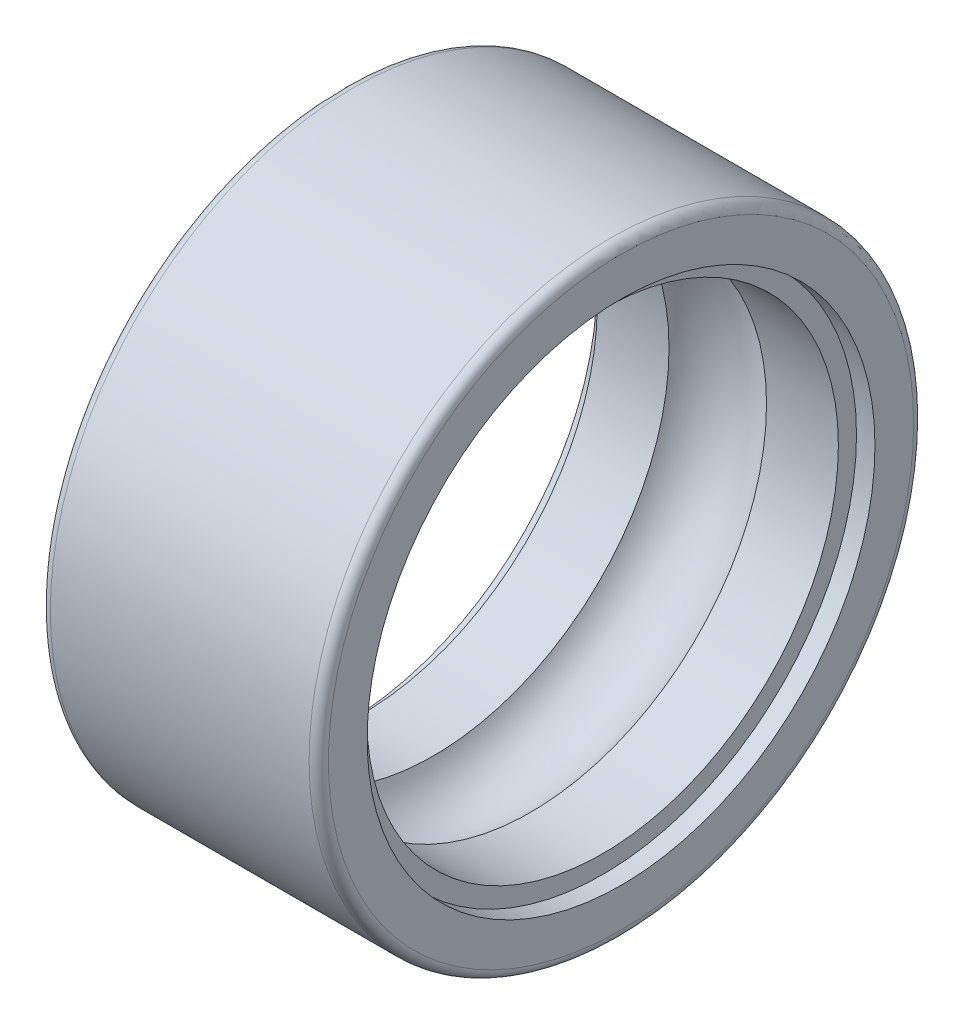
ISO-10303-21;
HEADER;
FILE_DESCRIPTION(('STEP AP214'),'2;1');
FILE_NAME('part.step','',(''),(''),'','','');
FILE_SCHEMA(('AUTOMOTIVE_DESIGN { 1 0 10303 214 1 1 1 1 }'));
ENDSEC;
DATA;
#1=APPLICATION_CONTEXT('core data for automotive mechanical design processes');
#2=APPLICATION_PROTOCOL_DEFINITION('international standard','automotive_design',2000,#1);
#3=PRODUCT_CONTEXT('',#1,'mechanical');
#4=PRODUCT('Part','Part','',(#3));
#5=PRODUCT_RELATED_PRODUCT_CATEGORY('part','',(#4));
#6=PRODUCT_DEFINITION_FORMATION('','',#4);
#7=PRODUCT_DEFINITION_CONTEXT('part definition',#1,'design');
#8=PRODUCT_DEFINITION('design','',#6,#7);
#9=PRODUCT_DEFINITION_SHAPE('','',#8);
#10=(LENGTH_UNIT() NAMED_UNIT(*) SI_UNIT(.MILLI.,.METRE.));
#11=(NAMED_UNIT(*) PLANE_ANGLE_UNIT() SI_UNIT($,.RADIAN.));
#12=(NAMED_UNIT(*) SI_UNIT($,.STERADIAN.) SOLID_ANGLE_UNIT());
#13=UNCERTAINTY_MEASURE_WITH_UNIT(LENGTH_MEASURE(1.E-05),#10,'distance_accuracy_value','');
#14=(GEOMETRIC_REPRESENTATION_CONTEXT(3) GLOBAL_UNCERTAINTY_ASSIGNED_CONTEXT((#13)) GLOBAL_UNIT_ASSIGNED_CONTEXT((#10,
#11,#12)) REPRESENTATION_CONTEXT('',''));
#15=CARTESIAN_POINT('',(0.,0.,0.));
#16=DIRECTION('',(0.,0.,1.));
#17=DIRECTION('',(1.,0.,0.));
#18=AXIS2_PLACEMENT_3D('',#15,#16,#17);
#19=CARTESIAN_POINT('',(0.,2.42,0.));
#20=DIRECTION('',(-1.,0.,0.));
#21=DIRECTION('',(0.,0.,1.));
#22=AXIS2_PLACEMENT_3D('',#19,#20,#21);
#23=PLANE('',#22);
#24=CARTESIAN_POINT('',(0.,0.,0.));
#25=DIRECTION('',(1.,0.,0.));
#26=DIRECTION('',(0.,0.,-1.));
#27=AXIS2_PLACEMENT_3D('',#24,#25,#26);
#28=CIRCLE('',#27,2.1);
#29=CARTESIAN_POINT('',(0.,0.,-2.1));
#30=VERTEX_POINT('',#29);
#31=EDGE_CURVE('E67',#30,#30,#28,.T.);
#32=ORIENTED_EDGE('',*,*,#31,.T.);
#33=EDGE_LOOP('',(#32));
#34=FACE_BOUND('',#33,.T.);
#35=CARTESIAN_POINT('',(0.,0.,0.));
#36=DIRECTION('',(1.,0.,0.));
#37=DIRECTION('',(0.,0.,-1.));
#38=AXIS2_PLACEMENT_3D('',#35,#36,#37);
#39=CIRCLE('',#38,2.42000000446036);
#40=CARTESIAN_POINT('',(0.,0.,-2.42000000446036));
#41=VERTEX_POINT('',#40);
#42=EDGE_CURVE('E63',#41,#41,#39,.T.);
#43=ORIENTED_EDGE('',*,*,#42,.F.);
#44=EDGE_LOOP('',(#43));
#45=FACE_BOUND('',#44,.T.);
#46=ADVANCED_FACE('F14',(#34,#45),#23,.T.);
#47=CARTESIAN_POINT('',(2.3,0.,0.));
#48=DIRECTION('',(1.,0.,0.));
#49=DIRECTION('',(0.,0.,-1.));
#50=AXIS2_PLACEMENT_3D('',#47,#48,#49);
#51=CYLINDRICAL_SURFACE('',#50,2.1);
#52=CARTESIAN_POINT('',(0.15272,0.,0.));
#53=DIRECTION('',(1.,0.,0.));
#54=DIRECTION('',(0.,0.,-1.));
#55=AXIS2_PLACEMENT_3D('',#52,#53,#54);
#56=CIRCLE('',#55,2.1);
#57=CARTESIAN_POINT('',(0.15272,0.,-2.1));
#58=VERTEX_POINT('',#57);
#59=EDGE_CURVE('E59',#58,#58,#56,.T.);
#60=ORIENTED_EDGE('',*,*,#59,.T.);
#61=EDGE_LOOP('',(#60));
#62=FACE_BOUND('',#61,.T.);
#63=ORIENTED_EDGE('',*,*,#31,.F.);
#64=EDGE_LOOP('',(#63));
#65=FACE_BOUND('',#64,.T.);
#66=ADVANCED_FACE('F74',(#62,#65),#51,.F.);
#67=CARTESIAN_POINT('',(0.15272,2.1,0.));
#68=DIRECTION('',(-1.,0.,0.));
#69=DIRECTION('',(0.,0.,1.));
#70=AXIS2_PLACEMENT_3D('',#67,#68,#69);
#71=PLANE('',#70);
#72=CARTESIAN_POINT('',(0.15272,0.,0.));
#73=DIRECTION('',(1.,0.,0.));
#74=DIRECTION('',(0.,0.,-1.));
#75=AXIS2_PLACEMENT_3D('',#72,#73,#74);
#76=CIRCLE('',#75,1.95);
#77=CARTESIAN_POINT('',(0.15272,0.,-1.95));
#78=VERTEX_POINT('',#77);
#79=EDGE_CURVE('E55',#78,#78,#76,.T.);
#80=ORIENTED_EDGE('',*,*,#79,.T.);
#81=EDGE_LOOP('',(#80));
#82=FACE_BOUND('',#81,.T.);
#83=ORIENTED_EDGE('',*,*,#59,.F.);
#84=EDGE_LOOP('',(#83));
#85=FACE_BOUND('',#84,.T.);
#86=ADVANCED_FACE('F76',(#82,#85),#71,.T.);
#87=CARTESIAN_POINT('',(2.3,0.,0.));
#88=DIRECTION('',(1.,0.,0.));
#89=DIRECTION('',(0.,0.,-1.));
#90=AXIS2_PLACEMENT_3D('',#87,#88,#89);
#91=CYLINDRICAL_SURFACE('',#90,1.95);
#92=CARTESIAN_POINT('',(0.74688711258507,0.,0.));
#93=DIRECTION('',(1.,0.,0.));
#94=DIRECTION('',(0.,0.,-1.));
#95=AXIS2_PLACEMENT_3D('',#92,#93,#94);
#96=CIRCLE('',#95,1.95);
#97=CARTESIAN_POINT('',(0.74688711258507,0.,-1.95));
#98=VERTEX_POINT('',#97);
#99=EDGE_CURVE('E51',#98,#98,#96,.T.);
#100=ORIENTED_EDGE('',*,*,#99,.T.);
#101=EDGE_LOOP('',(#100));
#102=FACE_BOUND('',#101,.T.);
#103=ORIENTED_EDGE('',*,*,#79,.F.);
#104=EDGE_LOOP('',(#103));
#105=FACE_BOUND('',#104,.T.);
#106=ADVANCED_FACE('F84',(#102,#105),#91,.F.);
#107=CARTESIAN_POINT('',(1.14999999999998,0.,0.));
#108=DIRECTION('',(1.,0.,0.));
#109=DIRECTION('',(0.,0.,-1.));
#110=AXIS2_PLACEMENT_3D('',#107,#108,#109);
#111=TOROIDAL_SURFACE('',#110,1.75,0.449999999999979);
#112=ORIENTED_EDGE('',*,*,#99,.F.);
#113=EDGE_LOOP('',(#112));
#114=FACE_BOUND('',#113,.T.);
#115=CARTESIAN_POINT('',(1.5531128874149,0.,0.));
#116=DIRECTION('',(1.,0.,0.));
#117=DIRECTION('',(0.,0.,-1.));
#118=AXIS2_PLACEMENT_3D('',#115,#116,#117);
#119=CIRCLE('',#118,1.95);
#120=CARTESIAN_POINT('',(1.5531128874149,0.,-1.95));
#121=VERTEX_POINT('',#120);
#122=EDGE_CURVE('E47',#121,#121,#119,.T.);
#123=ORIENTED_EDGE('',*,*,#122,.T.);
#124=EDGE_LOOP('',(#123));
#125=FACE_BOUND('',#124,.T.);
#126=ADVANCED_FACE('F91',(#114,#125),#111,.F.);
#127=CARTESIAN_POINT('',(2.3,0.,0.));
#128=DIRECTION('',(1.,0.,0.));
#129=DIRECTION('',(0.,0.,-1.));
#130=AXIS2_PLACEMENT_3D('',#127,#128,#129);
#131=CYLINDRICAL_SURFACE('',#130,1.95);
#132=CARTESIAN_POINT('',(2.14728,0.,0.));
#133=DIRECTION('',(1.,0.,0.));
#134=DIRECTION('',(0.,0.,-1.));
#135=AXIS2_PLACEMENT_3D('',#132,#133,#134);
#136=CIRCLE('',#135,1.95);
#137=CARTESIAN_POINT('',(2.14728,0.,-1.95));
#138=VERTEX_POINT('',#137);
#139=EDGE_CURVE('E43',#138,#138,#136,.T.);
#140=ORIENTED_EDGE('',*,*,#139,.T.);
#141=EDGE_LOOP('',(#140));
#142=FACE_BOUND('',#141,.T.);
#143=ORIENTED_EDGE('',*,*,#122,.F.);
#144=EDGE_LOOP('',(#143));
#145=FACE_BOUND('',#144,.T.);
#146=ADVANCED_FACE('F95',(#142,#145),#131,.F.);
#147=CARTESIAN_POINT('',(2.14728,1.95,0.));
#148=DIRECTION('',(1.,0.,0.));
#149=DIRECTION('',(0.,0.,-1.));
#150=AXIS2_PLACEMENT_3D('',#147,#148,#149);
#151=PLANE('',#150);
#152=CARTESIAN_POINT('',(2.14728,0.,0.));
#153=DIRECTION('',(1.,0.,0.));
#154=DIRECTION('',(0.,0.,-1.));
#155=AXIS2_PLACEMENT_3D('',#152,#153,#154);
#156=CIRCLE('',#155,2.1);
#157=CARTESIAN_POINT('',(2.14728,0.,-2.1));
#158=VERTEX_POINT('',#157);
#159=EDGE_CURVE('E39',#158,#158,#156,.T.);
#160=ORIENTED_EDGE('',*,*,#159,.T.);
#161=EDGE_LOOP('',(#160));
#162=FACE_BOUND('',#161,.T.);
#163=ORIENTED_EDGE('',*,*,#139,.F.);
#164=EDGE_LOOP('',(#163));
#165=FACE_BOUND('',#164,.T.);
#166=ADVANCED_FACE('F99',(#162,#165),#151,.T.);
#167=CARTESIAN_POINT('',(2.3,0.,0.));
#168=DIRECTION('',(1.,0.,0.));
#169=DIRECTION('',(0.,0.,-1.));
#170=AXIS2_PLACEMENT_3D('',#167,#168,#169);
#171=CYLINDRICAL_SURFACE('',#170,2.1);
#172=CARTESIAN_POINT('',(2.3,0.,0.));
#173=DIRECTION('',(1.,0.,0.));
#174=DIRECTION('',(0.,0.,-1.));
#175=AXIS2_PLACEMENT_3D('',#172,#173,#174);
#176=CIRCLE('',#175,2.1);
#177=CARTESIAN_POINT('',(2.3,0.,-2.1));
#178=VERTEX_POINT('',#177);
#179=EDGE_CURVE('E33',#178,#178,#176,.T.);
#180=ORIENTED_EDGE('',*,*,#179,.T.);
#181=EDGE_LOOP('',(#180));
#182=FACE_BOUND('',#181,.T.);
#183=ORIENTED_EDGE('',*,*,#159,.F.);
#184=EDGE_LOOP('',(#183));
#185=FACE_BOUND('',#184,.T.);
#186=ADVANCED_FACE('F103',(#182,#185),#171,.F.);
#187=CARTESIAN_POINT('',(2.3,2.1,0.));
#188=DIRECTION('',(1.,0.,0.));
#189=DIRECTION('',(0.,0.,-1.));
#190=AXIS2_PLACEMENT_3D('',#187,#188,#189);
#191=PLANE('',#190);
#192=CARTESIAN_POINT('',(2.3,0.,0.));
#193=DIRECTION('',(1.,0.,0.));
#194=DIRECTION('',(0.,0.,-1.));
#195=AXIS2_PLACEMENT_3D('',#192,#193,#194);
#196=CIRCLE('',#195,2.42000001647497);
#197=CARTESIAN_POINT('',(2.3,0.,-2.42000001647497));
#198=VERTEX_POINT('',#197);
#199=EDGE_CURVE('E28',#198,#198,#196,.T.);
#200=ORIENTED_EDGE('',*,*,#199,.T.);
#201=EDGE_LOOP('',(#200));
#202=FACE_BOUND('',#201,.T.);
#203=ORIENTED_EDGE('',*,*,#179,.F.);
#204=EDGE_LOOP('',(#203));
#205=FACE_BOUND('',#204,.T.);
#206=ADVANCED_FACE('F107',(#202,#205),#191,.T.);
#207=CARTESIAN_POINT('',(2.21999999999992,0.,0.));
#208=DIRECTION('',(1.,0.,0.));
#209=DIRECTION('',(0.,0.,-1.));
#210=AXIS2_PLACEMENT_3D('',#207,#208,#209);
#211=TOROIDAL_SURFACE('',#210,2.41999999999992,0.0800000000000817);
#212=CARTESIAN_POINT('',(2.22,0.,0.));
#213=DIRECTION('',(1.,0.,0.));
#214=DIRECTION('',(0.,0.,-1.));
#215=AXIS2_PLACEMENT_3D('',#212,#213,#214);
#216=CIRCLE('',#215,2.5);
#217=CARTESIAN_POINT('',(2.22,0.,-2.5));
#218=VERTEX_POINT('',#217);
#219=EDGE_CURVE('E22',#218,#218,#216,.T.);
#220=ORIENTED_EDGE('',*,*,#219,.T.);
#221=EDGE_LOOP('',(#220));
#222=FACE_BOUND('',#221,.T.);
#223=ORIENTED_EDGE('',*,*,#199,.F.);
#224=EDGE_LOOP('',(#223));
#225=FACE_BOUND('',#224,.T.);
#226=ADVANCED_FACE('F111',(#222,#225),#211,.T.);
#227=CARTESIAN_POINT('',(2.3,0.,0.));
#228=DIRECTION('',(1.,0.,0.));
#229=DIRECTION('',(0.,0.,-1.));
#230=AXIS2_PLACEMENT_3D('',#227,#228,#229);
#231=CYLINDRICAL_SURFACE('',#230,2.5);
#232=CARTESIAN_POINT('',(0.0800000000000014,0.,0.));
#233=DIRECTION('',(1.,0.,0.));
#234=DIRECTION('',(0.,0.,-1.));
#235=AXIS2_PLACEMENT_3D('',#232,#233,#234);
#236=CIRCLE('',#235,2.5);
#237=CARTESIAN_POINT('',(0.0800000000000014,0.,-2.5));
#238=VERTEX_POINT('',#237);
#239=EDGE_CURVE('E10',#238,#238,#236,.T.);
#240=ORIENTED_EDGE('',*,*,#239,.T.);
#241=EDGE_LOOP('',(#240));
#242=FACE_BOUND('',#241,.T.);
#243=ORIENTED_EDGE('',*,*,#219,.F.);
#244=EDGE_LOOP('',(#243));
#245=FACE_BOUND('',#244,.T.);
#246=ADVANCED_FACE('F114',(#242,#245),#231,.T.);
#247=CARTESIAN_POINT('',(0.0800000000000404,0.,0.));
#248=DIRECTION('',(1.,0.,0.));
#249=DIRECTION('',(0.,0.,-1.));
#250=AXIS2_PLACEMENT_3D('',#247,#248,#249);
#251=TOROIDAL_SURFACE('',#250,2.41999999999996,0.0800000000000401);
#252=ORIENTED_EDGE('',*,*,#42,.T.);
#253=EDGE_LOOP('',(#252));
#254=FACE_BOUND('',#253,.T.);
#255=ORIENTED_EDGE('',*,*,#239,.F.);
#256=EDGE_LOOP('',(#255));
#257=FACE_BOUND('',#256,.T.);
#258=ADVANCED_FACE('F16',(#254,#257),#251,.T.);
#259=CLOSED_SHELL('',(#46,#66,#86,#106,#126,#146,#166,#186,#206,#226,#246,#258));
#260=MANIFOLD_SOLID_BREP('B1',#259);
#261=ADVANCED_BREP_SHAPE_REPRESENTATION('',(#18,#260),#14);
#262=SHAPE_DEFINITION_REPRESENTATION(#9,#261);
ENDSEC;
END-ISO-10303-21;
